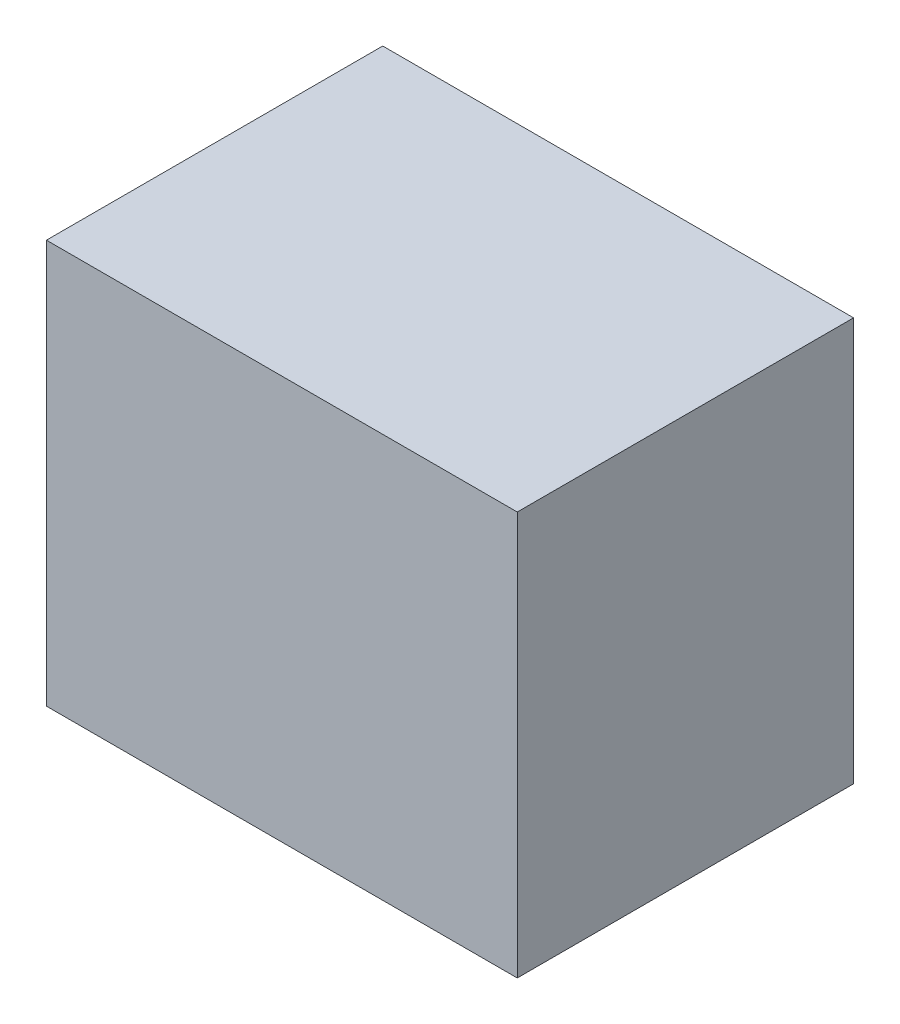
ISO-10303-21;
HEADER;
FILE_DESCRIPTION(('STEP AP214'),'2;1');
FILE_NAME('part.step','',(''),(''),'','','');
FILE_SCHEMA(('AUTOMOTIVE_DESIGN { 1 0 10303 214 1 1 1 1 }'));
ENDSEC;
DATA;
#1=APPLICATION_CONTEXT('core data for automotive mechanical design processes');
#2=APPLICATION_PROTOCOL_DEFINITION('international standard','automotive_design',2000,#1);
#3=PRODUCT_CONTEXT('',#1,'mechanical');
#4=PRODUCT('Part','Part','',(#3));
#5=PRODUCT_RELATED_PRODUCT_CATEGORY('part','',(#4));
#6=PRODUCT_DEFINITION_FORMATION('','',#4);
#7=PRODUCT_DEFINITION_CONTEXT('part definition',#1,'design');
#8=PRODUCT_DEFINITION('design','',#6,#7);
#9=PRODUCT_DEFINITION_SHAPE('','',#8);
#10=(LENGTH_UNIT() NAMED_UNIT(*) SI_UNIT(.MILLI.,.METRE.));
#11=(NAMED_UNIT(*) PLANE_ANGLE_UNIT() SI_UNIT($,.RADIAN.));
#12=(NAMED_UNIT(*) SI_UNIT($,.STERADIAN.) SOLID_ANGLE_UNIT());
#13=UNCERTAINTY_MEASURE_WITH_UNIT(LENGTH_MEASURE(1.E-05),#10,'distance_accuracy_value','');
#14=(GEOMETRIC_REPRESENTATION_CONTEXT(3) GLOBAL_UNCERTAINTY_ASSIGNED_CONTEXT((#13)) GLOBAL_UNIT_ASSIGNED_CONTEXT((#10,
#11,#12)) REPRESENTATION_CONTEXT('',''));
#15=CARTESIAN_POINT('',(0.,0.,0.));
#16=DIRECTION('',(0.,0.,1.));
#17=DIRECTION('',(1.,0.,0.));
#18=AXIS2_PLACEMENT_3D('',#15,#16,#17);
#19=CARTESIAN_POINT('',(0.,0.,500.));
#20=DIRECTION('',(1.,0.,0.));
#21=DIRECTION('',(0.,0.,-1.));
#22=AXIS2_PLACEMENT_3D('',#19,#20,#21);
#23=PLANE('',#22);
#24=DIRECTION('',(0.,-1.,0.));
#25=VECTOR('',#24,1.);
#26=CARTESIAN_POINT('',(0.,0.,0.));
#27=LINE('',#26,#25);
#28=CARTESIAN_POINT('',(0.,600.,0.));
#29=VERTEX_POINT('',#28);
#30=CARTESIAN_POINT('',(0.,0.,0.));
#31=VERTEX_POINT('',#30);
#32=EDGE_CURVE('E151',#29,#31,#27,.T.);
#33=ORIENTED_EDGE('',*,*,#32,.T.);
#34=DIRECTION('',(0.,0.,-1.));
#35=VECTOR('',#34,1.);
#36=CARTESIAN_POINT('',(0.,0.,500.));
#37=LINE('',#36,#35);
#38=CARTESIAN_POINT('',(0.,0.,500.));
#39=VERTEX_POINT('',#38);
#40=EDGE_CURVE('E140',#39,#31,#37,.T.);
#41=ORIENTED_EDGE('',*,*,#40,.F.);
#42=DIRECTION('',(0.,-1.,0.));
#43=VECTOR('',#42,1.);
#44=CARTESIAN_POINT('',(0.,0.,500.));
#45=LINE('',#44,#43);
#46=CARTESIAN_POINT('',(0.,600.,500.));
#47=VERTEX_POINT('',#46);
#48=EDGE_CURVE('E132',#47,#39,#45,.T.);
#49=ORIENTED_EDGE('',*,*,#48,.F.);
#50=DIRECTION('',(0.,0.,-1.));
#51=VECTOR('',#50,1.);
#52=CARTESIAN_POINT('',(0.,600.,500.));
#53=LINE('',#52,#51);
#54=EDGE_CURVE('E147',#47,#29,#53,.T.);
#55=ORIENTED_EDGE('',*,*,#54,.T.);
#56=EDGE_LOOP('',(#33,#41,#49,#55));
#57=FACE_BOUND('',#56,.T.);
#58=ADVANCED_FACE('F40',(#57),#23,.F.);
#59=CARTESIAN_POINT('',(0.,0.,500.));
#60=DIRECTION('',(0.,1.,0.));
#61=DIRECTION('',(0.,0.,1.));
#62=AXIS2_PLACEMENT_3D('',#59,#60,#61);
#63=PLANE('',#62);
#64=DIRECTION('',(1.,0.,0.));
#65=VECTOR('',#64,1.);
#66=CARTESIAN_POINT('',(0.,0.,0.));
#67=LINE('',#66,#65);
#68=CARTESIAN_POINT('',(700.,0.,0.));
#69=VERTEX_POINT('',#68);
#70=EDGE_CURVE('E138',#31,#69,#67,.T.);
#71=ORIENTED_EDGE('',*,*,#70,.T.);
#72=DIRECTION('',(0.,0.,-1.));
#73=VECTOR('',#72,1.);
#74=CARTESIAN_POINT('',(700.,0.,500.));
#75=LINE('',#74,#73);
#76=CARTESIAN_POINT('',(700.,0.,500.));
#77=VERTEX_POINT('',#76);
#78=EDGE_CURVE('E136',#77,#69,#75,.T.);
#79=ORIENTED_EDGE('',*,*,#78,.F.);
#80=DIRECTION('',(1.,0.,0.));
#81=VECTOR('',#80,1.);
#82=CARTESIAN_POINT('',(0.,0.,500.));
#83=LINE('',#82,#81);
#84=EDGE_CURVE('E127',#39,#77,#83,.T.);
#85=ORIENTED_EDGE('',*,*,#84,.F.);
#86=ORIENTED_EDGE('',*,*,#40,.T.);
#87=EDGE_LOOP('',(#71,#79,#85,#86));
#88=FACE_BOUND('',#87,.T.);
#89=ADVANCED_FACE('F137',(#88),#63,.F.);
#90=CARTESIAN_POINT('',(700.,0.,500.));
#91=DIRECTION('',(-1.,0.,0.));
#92=DIRECTION('',(0.,0.,1.));
#93=AXIS2_PLACEMENT_3D('',#90,#91,#92);
#94=PLANE('',#93);
#95=DIRECTION('',(0.,1.,0.));
#96=VECTOR('',#95,1.);
#97=CARTESIAN_POINT('',(700.,0.,0.));
#98=LINE('',#97,#96);
#99=CARTESIAN_POINT('',(700.,600.,0.));
#100=VERTEX_POINT('',#99);
#101=EDGE_CURVE('E113',#69,#100,#98,.T.);
#102=ORIENTED_EDGE('',*,*,#101,.T.);
#103=DIRECTION('',(0.,0.,-1.));
#104=VECTOR('',#103,1.);
#105=CARTESIAN_POINT('',(700.,600.,500.));
#106=LINE('',#105,#104);
#107=CARTESIAN_POINT('',(700.,600.,500.));
#108=VERTEX_POINT('',#107);
#109=EDGE_CURVE('E141',#108,#100,#106,.T.);
#110=ORIENTED_EDGE('',*,*,#109,.F.);
#111=DIRECTION('',(0.,1.,0.));
#112=VECTOR('',#111,1.);
#113=CARTESIAN_POINT('',(700.,0.,500.));
#114=LINE('',#113,#112);
#115=EDGE_CURVE('E130',#77,#108,#114,.T.);
#116=ORIENTED_EDGE('',*,*,#115,.F.);
#117=ORIENTED_EDGE('',*,*,#78,.T.);
#118=EDGE_LOOP('',(#102,#110,#116,#117));
#119=FACE_BOUND('',#118,.T.);
#120=ADVANCED_FACE('F143',(#119),#94,.F.);
#121=CARTESIAN_POINT('',(0.,600.,500.));
#122=DIRECTION('',(0.,-1.,0.));
#123=DIRECTION('',(0.,0.,-1.));
#124=AXIS2_PLACEMENT_3D('',#121,#122,#123);
#125=PLANE('',#124);
#126=DIRECTION('',(-1.,0.,0.));
#127=VECTOR('',#126,1.);
#128=CARTESIAN_POINT('',(0.,600.,0.));
#129=LINE('',#128,#127);
#130=EDGE_CURVE('E119',#100,#29,#129,.T.);
#131=ORIENTED_EDGE('',*,*,#130,.T.);
#132=ORIENTED_EDGE('',*,*,#54,.F.);
#133=DIRECTION('',(-1.,0.,0.));
#134=VECTOR('',#133,1.);
#135=CARTESIAN_POINT('',(0.,600.,500.));
#136=LINE('',#135,#134);
#137=EDGE_CURVE('E96',#108,#47,#136,.T.);
#138=ORIENTED_EDGE('',*,*,#137,.F.);
#139=ORIENTED_EDGE('',*,*,#109,.T.);
#140=EDGE_LOOP('',(#131,#132,#138,#139));
#141=FACE_BOUND('',#140,.T.);
#142=ADVANCED_FACE('F233',(#141),#125,.F.);
#143=CARTESIAN_POINT('',(0.,0.,500.));
#144=DIRECTION('',(0.,0.,-1.));
#145=DIRECTION('',(-1.,0.,0.));
#146=AXIS2_PLACEMENT_3D('',#143,#144,#145);
#147=PLANE('',#146);
#148=ORIENTED_EDGE('',*,*,#48,.T.);
#149=ORIENTED_EDGE('',*,*,#84,.T.);
#150=ORIENTED_EDGE('',*,*,#115,.T.);
#151=ORIENTED_EDGE('',*,*,#137,.T.);
#152=EDGE_LOOP('',(#148,#149,#150,#151));
#153=FACE_BOUND('',#152,.T.);
#154=ADVANCED_FACE('F128',(#153),#147,.F.);
#155=CARTESIAN_POINT('',(0.,0.,0.));
#156=DIRECTION('',(0.,0.,-1.));
#157=DIRECTION('',(-1.,0.,0.));
#158=AXIS2_PLACEMENT_3D('',#155,#156,#157);
#159=PLANE('',#158);
#160=ORIENTED_EDGE('',*,*,#32,.F.);
#161=ORIENTED_EDGE('',*,*,#130,.F.);
#162=ORIENTED_EDGE('',*,*,#101,.F.);
#163=ORIENTED_EDGE('',*,*,#70,.F.);
#164=EDGE_LOOP('',(#160,#161,#162,#163));
#165=FACE_BOUND('',#164,.T.);
#166=ADVANCED_FACE('F236',(#165),#159,.T.);
#167=CLOSED_SHELL('',(#58,#89,#120,#142,#154,#166));
#168=CARTESIAN_POINT('',(20.,0.,500.));
#169=DIRECTION('',(1.,0.,0.));
#170=DIRECTION('',(0.,0.,-1.));
#171=AXIS2_PLACEMENT_3D('',#168,#169,#170);
#172=PLANE('',#171);
#173=DIRECTION('',(0.,-1.,0.));
#174=VECTOR('',#173,1.);
#175=CARTESIAN_POINT('',(20.,0.,20.));
#176=LINE('',#175,#174);
#177=CARTESIAN_POINT('',(20.,580.,20.));
#178=VERTEX_POINT('',#177);
#179=CARTESIAN_POINT('',(20.,20.,20.));
#180=VERTEX_POINT('',#179);
#181=EDGE_CURVE('E44',#178,#180,#176,.T.);
#182=ORIENTED_EDGE('',*,*,#181,.F.);
#183=DIRECTION('',(0.,0.,-1.));
#184=VECTOR('',#183,1.);
#185=CARTESIAN_POINT('',(20.,580.,500.));
#186=LINE('',#185,#184);
#187=CARTESIAN_POINT('',(20.,580.,480.));
#188=VERTEX_POINT('',#187);
#189=EDGE_CURVE('E191',#188,#178,#186,.T.);
#190=ORIENTED_EDGE('',*,*,#189,.F.);
#191=DIRECTION('',(0.,-1.,0.));
#192=VECTOR('',#191,1.);
#193=CARTESIAN_POINT('',(20.,0.,480.));
#194=LINE('',#193,#192);
#195=CARTESIAN_POINT('',(20.,20.,480.));
#196=VERTEX_POINT('',#195);
#197=EDGE_CURVE('E171',#188,#196,#194,.T.);
#198=ORIENTED_EDGE('',*,*,#197,.T.);
#199=DIRECTION('',(0.,0.,-1.));
#200=VECTOR('',#199,1.);
#201=CARTESIAN_POINT('',(20.,20.,500.));
#202=LINE('',#201,#200);
#203=EDGE_CURVE('E187',#196,#180,#202,.T.);
#204=ORIENTED_EDGE('',*,*,#203,.T.);
#205=EDGE_LOOP('',(#182,#190,#198,#204));
#206=FACE_BOUND('',#205,.T.);
#207=ADVANCED_FACE('F200',(#206),#172,.T.);
#208=CARTESIAN_POINT('',(0.,20.,500.));
#209=DIRECTION('',(0.,1.,0.));
#210=DIRECTION('',(0.,0.,1.));
#211=AXIS2_PLACEMENT_3D('',#208,#209,#210);
#212=PLANE('',#211);
#213=DIRECTION('',(1.,0.,0.));
#214=VECTOR('',#213,1.);
#215=CARTESIAN_POINT('',(0.,20.,20.));
#216=LINE('',#215,#214);
#217=CARTESIAN_POINT('',(680.,20.,20.));
#218=VERTEX_POINT('',#217);
#219=EDGE_CURVE('E61',#180,#218,#216,.T.);
#220=ORIENTED_EDGE('',*,*,#219,.F.);
#221=ORIENTED_EDGE('',*,*,#203,.F.);
#222=DIRECTION('',(1.,0.,0.));
#223=VECTOR('',#222,1.);
#224=CARTESIAN_POINT('',(0.,20.,480.));
#225=LINE('',#224,#223);
#226=CARTESIAN_POINT('',(680.,20.,480.));
#227=VERTEX_POINT('',#226);
#228=EDGE_CURVE('E84',#196,#227,#225,.T.);
#229=ORIENTED_EDGE('',*,*,#228,.T.);
#230=DIRECTION('',(0.,0.,-1.));
#231=VECTOR('',#230,1.);
#232=CARTESIAN_POINT('',(680.,20.,500.));
#233=LINE('',#232,#231);
#234=EDGE_CURVE('E181',#227,#218,#233,.T.);
#235=ORIENTED_EDGE('',*,*,#234,.T.);
#236=EDGE_LOOP('',(#220,#221,#229,#235));
#237=FACE_BOUND('',#236,.T.);
#238=ADVANCED_FACE('F201',(#237),#212,.T.);
#239=CARTESIAN_POINT('',(680.,0.,500.));
#240=DIRECTION('',(-1.,0.,0.));
#241=DIRECTION('',(0.,0.,1.));
#242=AXIS2_PLACEMENT_3D('',#239,#240,#241);
#243=PLANE('',#242);
#244=DIRECTION('',(0.,1.,0.));
#245=VECTOR('',#244,1.);
#246=CARTESIAN_POINT('',(680.,0.,20.));
#247=LINE('',#246,#245);
#248=CARTESIAN_POINT('',(680.,580.,20.));
#249=VERTEX_POINT('',#248);
#250=EDGE_CURVE('E184',#218,#249,#247,.T.);
#251=ORIENTED_EDGE('',*,*,#250,.F.);
#252=ORIENTED_EDGE('',*,*,#234,.F.);
#253=DIRECTION('',(0.,1.,0.));
#254=VECTOR('',#253,1.);
#255=CARTESIAN_POINT('',(680.,0.,480.));
#256=LINE('',#255,#254);
#257=CARTESIAN_POINT('',(680.,580.,480.));
#258=VERTEX_POINT('',#257);
#259=EDGE_CURVE('E52',#227,#258,#256,.T.);
#260=ORIENTED_EDGE('',*,*,#259,.T.);
#261=DIRECTION('',(0.,0.,-1.));
#262=VECTOR('',#261,1.);
#263=CARTESIAN_POINT('',(680.,580.,500.));
#264=LINE('',#263,#262);
#265=EDGE_CURVE('E174',#258,#249,#264,.T.);
#266=ORIENTED_EDGE('',*,*,#265,.T.);
#267=EDGE_LOOP('',(#251,#252,#260,#266));
#268=FACE_BOUND('',#267,.T.);
#269=ADVANCED_FACE('F205',(#268),#243,.T.);
#270=CARTESIAN_POINT('',(0.,580.,500.));
#271=DIRECTION('',(0.,-1.,0.));
#272=DIRECTION('',(0.,0.,-1.));
#273=AXIS2_PLACEMENT_3D('',#270,#271,#272);
#274=PLANE('',#273);
#275=DIRECTION('',(-1.,0.,0.));
#276=VECTOR('',#275,1.);
#277=CARTESIAN_POINT('',(0.,580.,20.));
#278=LINE('',#277,#276);
#279=EDGE_CURVE('E178',#249,#178,#278,.T.);
#280=ORIENTED_EDGE('',*,*,#279,.F.);
#281=ORIENTED_EDGE('',*,*,#265,.F.);
#282=DIRECTION('',(-1.,0.,0.));
#283=VECTOR('',#282,1.);
#284=CARTESIAN_POINT('',(0.,580.,480.));
#285=LINE('',#284,#283);
#286=EDGE_CURVE('E11',#258,#188,#285,.T.);
#287=ORIENTED_EDGE('',*,*,#286,.T.);
#288=ORIENTED_EDGE('',*,*,#189,.T.);
#289=EDGE_LOOP('',(#280,#281,#287,#288));
#290=FACE_BOUND('',#289,.T.);
#291=ADVANCED_FACE('F209',(#290),#274,.T.);
#292=CARTESIAN_POINT('',(0.,0.,480.));
#293=DIRECTION('',(0.,0.,-1.));
#294=DIRECTION('',(-1.,0.,0.));
#295=AXIS2_PLACEMENT_3D('',#292,#293,#294);
#296=PLANE('',#295);
#297=ORIENTED_EDGE('',*,*,#197,.F.);
#298=ORIENTED_EDGE('',*,*,#286,.F.);
#299=ORIENTED_EDGE('',*,*,#259,.F.);
#300=ORIENTED_EDGE('',*,*,#228,.F.);
#301=EDGE_LOOP('',(#297,#298,#299,#300));
#302=FACE_BOUND('',#301,.T.);
#303=ADVANCED_FACE('F208',(#302),#296,.T.);
#304=CARTESIAN_POINT('',(0.,0.,20.));
#305=DIRECTION('',(0.,0.,-1.));
#306=DIRECTION('',(-1.,0.,0.));
#307=AXIS2_PLACEMENT_3D('',#304,#305,#306);
#308=PLANE('',#307);
#309=ORIENTED_EDGE('',*,*,#181,.T.);
#310=ORIENTED_EDGE('',*,*,#219,.T.);
#311=ORIENTED_EDGE('',*,*,#250,.T.);
#312=ORIENTED_EDGE('',*,*,#279,.T.);
#313=EDGE_LOOP('',(#309,#310,#311,#312));
#314=FACE_BOUND('',#313,.T.);
#315=ADVANCED_FACE('F42',(#314),#308,.F.);
#316=CLOSED_SHELL('',(#207,#238,#269,#291,#303,#315));
#317=ORIENTED_CLOSED_SHELL('',*,#316,.T.);
#318=BREP_WITH_VOIDS('B2',#167,(#317));
#319=ADVANCED_BREP_SHAPE_REPRESENTATION('',(#18,#318),#14);
#320=SHAPE_DEFINITION_REPRESENTATION(#9,#319);
ENDSEC;
END-ISO-10303-21;
